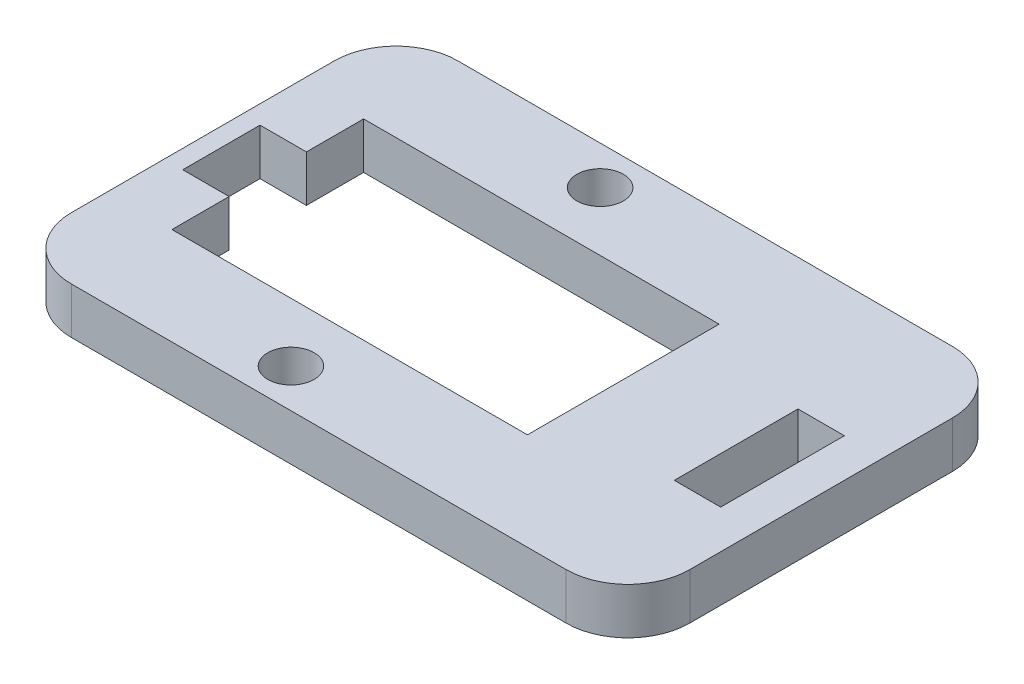
ISO-10303-21;
HEADER;
FILE_DESCRIPTION(('STEP AP214'),'2;1');
FILE_NAME('part.step','',(''),(''),'','','');
FILE_SCHEMA(('AUTOMOTIVE_DESIGN { 1 0 10303 214 1 1 1 1 }'));
ENDSEC;
DATA;
#1=APPLICATION_CONTEXT('core data for automotive mechanical design processes');
#2=APPLICATION_PROTOCOL_DEFINITION('international standard','automotive_design',2000,#1);
#3=PRODUCT_CONTEXT('',#1,'mechanical');
#4=PRODUCT('Part','Part','',(#3));
#5=PRODUCT_RELATED_PRODUCT_CATEGORY('part','',(#4));
#6=PRODUCT_DEFINITION_FORMATION('','',#4);
#7=PRODUCT_DEFINITION_CONTEXT('part definition',#1,'design');
#8=PRODUCT_DEFINITION('design','',#6,#7);
#9=PRODUCT_DEFINITION_SHAPE('','',#8);
#10=(LENGTH_UNIT() NAMED_UNIT(*) SI_UNIT(.MILLI.,.METRE.));
#11=(NAMED_UNIT(*) PLANE_ANGLE_UNIT() SI_UNIT($,.RADIAN.));
#12=(NAMED_UNIT(*) SI_UNIT($,.STERADIAN.) SOLID_ANGLE_UNIT());
#13=UNCERTAINTY_MEASURE_WITH_UNIT(LENGTH_MEASURE(1.E-05),#10,'distance_accuracy_value','');
#14=(GEOMETRIC_REPRESENTATION_CONTEXT(3) GLOBAL_UNCERTAINTY_ASSIGNED_CONTEXT((#13)) GLOBAL_UNIT_ASSIGNED_CONTEXT((#10,
#11,#12)) REPRESENTATION_CONTEXT('',''));
#15=CARTESIAN_POINT('',(0.,0.,0.));
#16=DIRECTION('',(0.,0.,1.));
#17=DIRECTION('',(1.,0.,0.));
#18=AXIS2_PLACEMENT_3D('',#15,#16,#17);
#19=CARTESIAN_POINT('',(4.2,3.,6.20000000000001));
#20=DIRECTION('',(-1.,0.,0.));
#21=DIRECTION('',(0.,0.,1.));
#22=AXIS2_PLACEMENT_3D('',#19,#20,#21);
#23=PLANE('',#22);
#24=DIRECTION('',(0.,0.,-1.));
#25=VECTOR('',#24,1.);
#26=CARTESIAN_POINT('',(4.2,0.,6.20000000000001));
#27=LINE('',#26,#25);
#28=CARTESIAN_POINT('',(4.2,0.,6.20000000000001));
#29=VERTEX_POINT('',#28);
#30=CARTESIAN_POINT('',(4.2,0.,2.5));
#31=VERTEX_POINT('',#30);
#32=EDGE_CURVE('E237',#29,#31,#27,.T.);
#33=ORIENTED_EDGE('',*,*,#32,.T.);
#34=DIRECTION('',(0.,-1.,0.));
#35=VECTOR('',#34,1.);
#36=CARTESIAN_POINT('',(4.2,3.,2.5));
#37=LINE('',#36,#35);
#38=CARTESIAN_POINT('',(4.2,3.,2.5));
#39=VERTEX_POINT('',#38);
#40=EDGE_CURVE('E209',#39,#31,#37,.T.);
#41=ORIENTED_EDGE('',*,*,#40,.F.);
#42=DIRECTION('',(0.,0.,-1.));
#43=VECTOR('',#42,1.);
#44=CARTESIAN_POINT('',(4.2,3.,6.20000000000001));
#45=LINE('',#44,#43);
#46=CARTESIAN_POINT('',(4.2,3.,6.20000000000001));
#47=VERTEX_POINT('',#46);
#48=EDGE_CURVE('E224',#47,#39,#45,.T.);
#49=ORIENTED_EDGE('',*,*,#48,.F.);
#50=DIRECTION('',(0.,-1.,0.));
#51=VECTOR('',#50,1.);
#52=CARTESIAN_POINT('',(4.2,3.,6.20000000000001));
#53=LINE('',#52,#51);
#54=EDGE_CURVE('E249',#47,#29,#53,.T.);
#55=ORIENTED_EDGE('',*,*,#54,.T.);
#56=EDGE_LOOP('',(#33,#41,#49,#55));
#57=FACE_BOUND('',#56,.T.);
#58=ADVANCED_FACE('F36',(#57),#23,.F.);
#59=CARTESIAN_POINT('',(0.,3.,0.));
#60=DIRECTION('',(0.,-1.,0.));
#61=DIRECTION('',(0.,0.,-1.));
#62=AXIS2_PLACEMENT_3D('',#59,#60,#61);
#63=PLANE('',#62);
#64=CARTESIAN_POINT('',(15.7,3.,-10.));
#65=DIRECTION('',(0.,-1.,0.));
#66=DIRECTION('',(0.,0.,-1.));
#67=AXIS2_PLACEMENT_3D('',#64,#65,#66);
#68=CIRCLE('',#67,1.5);
#69=CARTESIAN_POINT('',(15.7,3.,-11.5));
#70=VERTEX_POINT('',#69);
#71=EDGE_CURVE('E214',#70,#70,#68,.T.);
#72=ORIENTED_EDGE('',*,*,#71,.T.);
#73=EDGE_LOOP('',(#72));
#74=FACE_BOUND('',#73,.T.);
#75=CARTESIAN_POINT('',(15.7,3.,10.));
#76=DIRECTION('',(0.,-1.,0.));
#77=DIRECTION('',(0.,0.,-1.));
#78=AXIS2_PLACEMENT_3D('',#75,#76,#77);
#79=CIRCLE('',#78,1.5);
#80=CARTESIAN_POINT('',(15.7,3.,8.5));
#81=VERTEX_POINT('',#80);
#82=EDGE_CURVE('E220',#81,#81,#79,.T.);
#83=ORIENTED_EDGE('',*,*,#82,.T.);
#84=EDGE_LOOP('',(#83));
#85=FACE_BOUND('',#84,.T.);
#86=ORIENTED_EDGE('',*,*,#48,.T.);
#87=DIRECTION('',(-1.,0.,0.));
#88=VECTOR('',#87,1.);
#89=CARTESIAN_POINT('',(4.2,3.,2.5));
#90=LINE('',#89,#88);
#91=CARTESIAN_POINT('',(1.19999999999999,3.,2.5));
#92=VERTEX_POINT('',#91);
#93=EDGE_CURVE('E186',#39,#92,#90,.T.);
#94=ORIENTED_EDGE('',*,*,#93,.T.);
#95=DIRECTION('',(0.,0.,-1.));
#96=VECTOR('',#95,1.);
#97=CARTESIAN_POINT('',(1.19999999999999,3.,-2.5));
#98=LINE('',#97,#96);
#99=CARTESIAN_POINT('',(1.19999999999999,3.,-2.5));
#100=VERTEX_POINT('',#99);
#101=EDGE_CURVE('E179',#92,#100,#98,.T.);
#102=ORIENTED_EDGE('',*,*,#101,.T.);
#103=DIRECTION('',(1.,0.,0.));
#104=VECTOR('',#103,1.);
#105=CARTESIAN_POINT('',(4.2,3.,-2.5));
#106=LINE('',#105,#104);
#107=CARTESIAN_POINT('',(4.2,3.,-2.5));
#108=VERTEX_POINT('',#107);
#109=EDGE_CURVE('E189',#100,#108,#106,.T.);
#110=ORIENTED_EDGE('',*,*,#109,.T.);
#111=CARTESIAN_POINT('',(4.2,3.,-6.2));
#112=VERTEX_POINT('',#111);
#113=EDGE_CURVE('E227',#108,#112,#45,.T.);
#114=ORIENTED_EDGE('',*,*,#113,.T.);
#115=DIRECTION('',(1.,0.,0.));
#116=VECTOR('',#115,1.);
#117=CARTESIAN_POINT('',(27.2,3.,-6.19999999999998));
#118=LINE('',#117,#116);
#119=CARTESIAN_POINT('',(27.2,3.,-6.19999999999998));
#120=VERTEX_POINT('',#119);
#121=EDGE_CURVE('E226',#112,#120,#118,.T.);
#122=ORIENTED_EDGE('',*,*,#121,.T.);
#123=DIRECTION('',(0.,0.,1.));
#124=VECTOR('',#123,1.);
#125=CARTESIAN_POINT('',(27.2,3.,6.20000000000002));
#126=LINE('',#125,#124);
#127=CARTESIAN_POINT('',(27.2,3.,6.20000000000002));
#128=VERTEX_POINT('',#127);
#129=EDGE_CURVE('E230',#120,#128,#126,.T.);
#130=ORIENTED_EDGE('',*,*,#129,.T.);
#131=DIRECTION('',(-1.,0.,0.));
#132=VECTOR('',#131,1.);
#133=CARTESIAN_POINT('',(27.2,3.,6.20000000000002));
#134=LINE('',#133,#132);
#135=EDGE_CURVE('E233',#128,#47,#134,.T.);
#136=ORIENTED_EDGE('',*,*,#135,.T.);
#137=EDGE_LOOP('',(#86,#94,#102,#110,#114,#122,#130,#136));
#138=FACE_BOUND('',#137,.T.);
#139=DIRECTION('',(-1.,0.,0.));
#140=VECTOR('',#139,1.);
#141=CARTESIAN_POINT('',(40.,3.,-12.5));
#142=LINE('',#141,#140);
#143=CARTESIAN_POINT('',(36.,3.,-12.5));
#144=VERTEX_POINT('',#143);
#145=CARTESIAN_POINT('',(4.,3.,-12.5));
#146=VERTEX_POINT('',#145);
#147=EDGE_CURVE('E297',#144,#146,#142,.T.);
#148=ORIENTED_EDGE('',*,*,#147,.T.);
#149=CARTESIAN_POINT('',(4.,3.,-8.5));
#150=DIRECTION('',(0.,-1.,0.));
#151=DIRECTION('',(0.,0.,-1.));
#152=AXIS2_PLACEMENT_3D('',#149,#150,#151);
#153=CIRCLE('',#152,4.);
#154=CARTESIAN_POINT('',(0.,3.,-8.5));
#155=VERTEX_POINT('',#154);
#156=EDGE_CURVE('E332',#146,#155,#153,.F.);
#157=ORIENTED_EDGE('',*,*,#156,.T.);
#158=DIRECTION('',(0.,0.,1.));
#159=VECTOR('',#158,1.);
#160=CARTESIAN_POINT('',(0.,3.,-12.5));
#161=LINE('',#160,#159);
#162=CARTESIAN_POINT('',(0.,3.,8.5));
#163=VERTEX_POINT('',#162);
#164=EDGE_CURVE('E289',#155,#163,#161,.T.);
#165=ORIENTED_EDGE('',*,*,#164,.T.);
#166=CARTESIAN_POINT('',(4.,3.,8.5));
#167=DIRECTION('',(0.,-1.,0.));
#168=DIRECTION('',(0.,0.,-1.));
#169=AXIS2_PLACEMENT_3D('',#166,#167,#168);
#170=CIRCLE('',#169,4.);
#171=CARTESIAN_POINT('',(4.,3.,12.5));
#172=VERTEX_POINT('',#171);
#173=EDGE_CURVE('E328',#163,#172,#170,.F.);
#174=ORIENTED_EDGE('',*,*,#173,.T.);
#175=DIRECTION('',(1.,0.,0.));
#176=VECTOR('',#175,1.);
#177=CARTESIAN_POINT('',(40.,3.,12.5));
#178=LINE('',#177,#176);
#179=CARTESIAN_POINT('',(36.,3.,12.5));
#180=VERTEX_POINT('',#179);
#181=EDGE_CURVE('E292',#172,#180,#178,.T.);
#182=ORIENTED_EDGE('',*,*,#181,.T.);
#183=CARTESIAN_POINT('',(36.,3.,8.5));
#184=DIRECTION('',(0.,-1.,0.));
#185=DIRECTION('',(0.,0.,-1.));
#186=AXIS2_PLACEMENT_3D('',#183,#184,#185);
#187=CIRCLE('',#186,4.);
#188=CARTESIAN_POINT('',(40.,3.,8.5));
#189=VERTEX_POINT('',#188);
#190=EDGE_CURVE('E58',#180,#189,#187,.F.);
#191=ORIENTED_EDGE('',*,*,#190,.T.);
#192=DIRECTION('',(0.,0.,-1.));
#193=VECTOR('',#192,1.);
#194=CARTESIAN_POINT('',(40.,3.,-12.5));
#195=LINE('',#194,#193);
#196=CARTESIAN_POINT('',(40.,3.,-8.5));
#197=VERTEX_POINT('',#196);
#198=EDGE_CURVE('E295',#189,#197,#195,.T.);
#199=ORIENTED_EDGE('',*,*,#198,.T.);
#200=CARTESIAN_POINT('',(36.,3.,-8.5));
#201=DIRECTION('',(0.,-1.,0.));
#202=DIRECTION('',(0.,0.,-1.));
#203=AXIS2_PLACEMENT_3D('',#200,#201,#202);
#204=CIRCLE('',#203,4.);
#205=EDGE_CURVE('E330',#197,#144,#204,.F.);
#206=ORIENTED_EDGE('',*,*,#205,.T.);
#207=EDGE_LOOP('',(#148,#157,#165,#174,#182,#191,#199,#206));
#208=FACE_BOUND('',#207,.T.);
#209=DIRECTION('',(0.,0.,1.));
#210=VECTOR('',#209,1.);
#211=CARTESIAN_POINT('',(34.5,3.,-4.));
#212=LINE('',#211,#210);
#213=CARTESIAN_POINT('',(34.5,3.,-4.));
#214=VERTEX_POINT('',#213);
#215=CARTESIAN_POINT('',(34.5,3.,4.));
#216=VERTEX_POINT('',#215);
#217=EDGE_CURVE('E258',#214,#216,#212,.T.);
#218=ORIENTED_EDGE('',*,*,#217,.F.);
#219=DIRECTION('',(-1.,0.,0.));
#220=VECTOR('',#219,1.);
#221=CARTESIAN_POINT('',(37.5,3.,-4.));
#222=LINE('',#221,#220);
#223=CARTESIAN_POINT('',(37.5,3.,-4.));
#224=VERTEX_POINT('',#223);
#225=EDGE_CURVE('E266',#224,#214,#222,.T.);
#226=ORIENTED_EDGE('',*,*,#225,.F.);
#227=DIRECTION('',(0.,0.,-1.));
#228=VECTOR('',#227,1.);
#229=CARTESIAN_POINT('',(37.5,3.,-4.));
#230=LINE('',#229,#228);
#231=CARTESIAN_POINT('',(37.5,3.,4.));
#232=VERTEX_POINT('',#231);
#233=EDGE_CURVE('E263',#232,#224,#230,.T.);
#234=ORIENTED_EDGE('',*,*,#233,.F.);
#235=DIRECTION('',(1.,0.,0.));
#236=VECTOR('',#235,1.);
#237=CARTESIAN_POINT('',(37.5,3.,4.));
#238=LINE('',#237,#236);
#239=EDGE_CURVE('E260',#216,#232,#238,.T.);
#240=ORIENTED_EDGE('',*,*,#239,.F.);
#241=EDGE_LOOP('',(#218,#226,#234,#240));
#242=FACE_BOUND('',#241,.T.);
#243=ADVANCED_FACE('F196',(#74,#85,#138,#208,#242),#63,.F.);
#244=CARTESIAN_POINT('',(0.,0.,0.));
#245=DIRECTION('',(0.,-1.,0.));
#246=DIRECTION('',(0.,0.,-1.));
#247=AXIS2_PLACEMENT_3D('',#244,#245,#246);
#248=PLANE('',#247);
#249=DIRECTION('',(-1.,0.,0.));
#250=VECTOR('',#249,1.);
#251=CARTESIAN_POINT('',(4.2,0.,2.5));
#252=LINE('',#251,#250);
#253=CARTESIAN_POINT('',(1.19999999999999,0.,2.5));
#254=VERTEX_POINT('',#253);
#255=EDGE_CURVE('E197',#31,#254,#252,.T.);
#256=ORIENTED_EDGE('',*,*,#255,.F.);
#257=ORIENTED_EDGE('',*,*,#32,.F.);
#258=DIRECTION('',(-1.,0.,0.));
#259=VECTOR('',#258,1.);
#260=CARTESIAN_POINT('',(27.2,0.,6.20000000000002));
#261=LINE('',#260,#259);
#262=CARTESIAN_POINT('',(27.2,0.,6.20000000000002));
#263=VERTEX_POINT('',#262);
#264=EDGE_CURVE('E246',#263,#29,#261,.T.);
#265=ORIENTED_EDGE('',*,*,#264,.F.);
#266=DIRECTION('',(0.,0.,1.));
#267=VECTOR('',#266,1.);
#268=CARTESIAN_POINT('',(27.2,0.,6.20000000000002));
#269=LINE('',#268,#267);
#270=CARTESIAN_POINT('',(27.2,0.,-6.19999999999998));
#271=VERTEX_POINT('',#270);
#272=EDGE_CURVE('E243',#271,#263,#269,.T.);
#273=ORIENTED_EDGE('',*,*,#272,.F.);
#274=DIRECTION('',(1.,0.,0.));
#275=VECTOR('',#274,1.);
#276=CARTESIAN_POINT('',(27.2,0.,-6.19999999999998));
#277=LINE('',#276,#275);
#278=CARTESIAN_POINT('',(4.2,0.,-6.2));
#279=VERTEX_POINT('',#278);
#280=EDGE_CURVE('E240',#279,#271,#277,.T.);
#281=ORIENTED_EDGE('',*,*,#280,.F.);
#282=CARTESIAN_POINT('',(4.2,0.,-2.5));
#283=VERTEX_POINT('',#282);
#284=EDGE_CURVE('E223',#283,#279,#27,.T.);
#285=ORIENTED_EDGE('',*,*,#284,.F.);
#286=DIRECTION('',(1.,0.,0.));
#287=VECTOR('',#286,1.);
#288=CARTESIAN_POINT('',(4.2,0.,-2.5));
#289=LINE('',#288,#287);
#290=CARTESIAN_POINT('',(1.19999999999999,0.,-2.5));
#291=VERTEX_POINT('',#290);
#292=EDGE_CURVE('E200',#291,#283,#289,.T.);
#293=ORIENTED_EDGE('',*,*,#292,.F.);
#294=DIRECTION('',(0.,0.,-1.));
#295=VECTOR('',#294,1.);
#296=CARTESIAN_POINT('',(1.19999999999999,0.,-2.5));
#297=LINE('',#296,#295);
#298=EDGE_CURVE('E182',#254,#291,#297,.T.);
#299=ORIENTED_EDGE('',*,*,#298,.F.);
#300=EDGE_LOOP('',(#256,#257,#265,#273,#281,#285,#293,#299));
#301=FACE_BOUND('',#300,.T.);
#302=CARTESIAN_POINT('',(15.7,0.,-10.));
#303=DIRECTION('',(0.,-1.,0.));
#304=DIRECTION('',(0.,0.,-1.));
#305=AXIS2_PLACEMENT_3D('',#302,#303,#304);
#306=CIRCLE('',#305,1.5);
#307=CARTESIAN_POINT('',(15.7,0.,-11.5));
#308=VERTEX_POINT('',#307);
#309=EDGE_CURVE('E208',#308,#308,#306,.T.);
#310=ORIENTED_EDGE('',*,*,#309,.F.);
#311=EDGE_LOOP('',(#310));
#312=FACE_BOUND('',#311,.T.);
#313=CARTESIAN_POINT('',(15.7,0.,10.));
#314=DIRECTION('',(0.,-1.,0.));
#315=DIRECTION('',(0.,0.,-1.));
#316=AXIS2_PLACEMENT_3D('',#313,#314,#315);
#317=CIRCLE('',#316,1.5);
#318=CARTESIAN_POINT('',(15.7,0.,8.5));
#319=VERTEX_POINT('',#318);
#320=EDGE_CURVE('E217',#319,#319,#317,.T.);
#321=ORIENTED_EDGE('',*,*,#320,.F.);
#322=EDGE_LOOP('',(#321));
#323=FACE_BOUND('',#322,.T.);
#324=DIRECTION('',(0.,0.,1.));
#325=VECTOR('',#324,1.);
#326=CARTESIAN_POINT('',(0.,0.,-12.5));
#327=LINE('',#326,#325);
#328=CARTESIAN_POINT('',(0.,0.,-8.5));
#329=VERTEX_POINT('',#328);
#330=CARTESIAN_POINT('',(0.,0.,8.5));
#331=VERTEX_POINT('',#330);
#332=EDGE_CURVE('E288',#329,#331,#327,.T.);
#333=ORIENTED_EDGE('',*,*,#332,.F.);
#334=CARTESIAN_POINT('',(4.,0.,-8.5));
#335=DIRECTION('',(0.,-1.,0.));
#336=DIRECTION('',(0.,0.,-1.));
#337=AXIS2_PLACEMENT_3D('',#334,#335,#336);
#338=CIRCLE('',#337,4.);
#339=CARTESIAN_POINT('',(4.,0.,-12.5));
#340=VERTEX_POINT('',#339);
#341=EDGE_CURVE('E320',#329,#340,#338,.T.);
#342=ORIENTED_EDGE('',*,*,#341,.T.);
#343=DIRECTION('',(-1.,0.,0.));
#344=VECTOR('',#343,1.);
#345=CARTESIAN_POINT('',(40.,0.,-12.5));
#346=LINE('',#345,#344);
#347=CARTESIAN_POINT('',(36.,0.,-12.5));
#348=VERTEX_POINT('',#347);
#349=EDGE_CURVE('E293',#348,#340,#346,.T.);
#350=ORIENTED_EDGE('',*,*,#349,.F.);
#351=CARTESIAN_POINT('',(36.,0.,-8.5));
#352=DIRECTION('',(0.,-1.,0.));
#353=DIRECTION('',(0.,0.,-1.));
#354=AXIS2_PLACEMENT_3D('',#351,#352,#353);
#355=CIRCLE('',#354,4.);
#356=CARTESIAN_POINT('',(40.,0.,-8.5));
#357=VERTEX_POINT('',#356);
#358=EDGE_CURVE('E318',#348,#357,#355,.T.);
#359=ORIENTED_EDGE('',*,*,#358,.T.);
#360=DIRECTION('',(0.,0.,-1.));
#361=VECTOR('',#360,1.);
#362=CARTESIAN_POINT('',(40.,0.,-12.5));
#363=LINE('',#362,#361);
#364=CARTESIAN_POINT('',(40.,0.,8.5));
#365=VERTEX_POINT('',#364);
#366=EDGE_CURVE('E306',#365,#357,#363,.T.);
#367=ORIENTED_EDGE('',*,*,#366,.F.);
#368=CARTESIAN_POINT('',(36.,0.,8.5));
#369=DIRECTION('',(0.,-1.,0.));
#370=DIRECTION('',(0.,0.,-1.));
#371=AXIS2_PLACEMENT_3D('',#368,#369,#370);
#372=CIRCLE('',#371,4.);
#373=CARTESIAN_POINT('',(36.,0.,12.5));
#374=VERTEX_POINT('',#373);
#375=EDGE_CURVE('E314',#365,#374,#372,.T.);
#376=ORIENTED_EDGE('',*,*,#375,.T.);
#377=DIRECTION('',(1.,0.,0.));
#378=VECTOR('',#377,1.);
#379=CARTESIAN_POINT('',(40.,0.,12.5));
#380=LINE('',#379,#378);
#381=CARTESIAN_POINT('',(4.,0.,12.5));
#382=VERTEX_POINT('',#381);
#383=EDGE_CURVE('E303',#382,#374,#380,.T.);
#384=ORIENTED_EDGE('',*,*,#383,.F.);
#385=CARTESIAN_POINT('',(4.,0.,8.5));
#386=DIRECTION('',(0.,-1.,0.));
#387=DIRECTION('',(0.,0.,-1.));
#388=AXIS2_PLACEMENT_3D('',#385,#386,#387);
#389=CIRCLE('',#388,4.);
#390=EDGE_CURVE('E316',#382,#331,#389,.T.);
#391=ORIENTED_EDGE('',*,*,#390,.T.);
#392=EDGE_LOOP('',(#333,#342,#350,#359,#367,#376,#384,#391));
#393=FACE_BOUND('',#392,.T.);
#394=DIRECTION('',(-1.,0.,0.));
#395=VECTOR('',#394,1.);
#396=CARTESIAN_POINT('',(37.5,0.,-4.));
#397=LINE('',#396,#395);
#398=CARTESIAN_POINT('',(37.5,0.,-4.));
#399=VERTEX_POINT('',#398);
#400=CARTESIAN_POINT('',(34.5,0.,-4.));
#401=VERTEX_POINT('',#400);
#402=EDGE_CURVE('E261',#399,#401,#397,.T.);
#403=ORIENTED_EDGE('',*,*,#402,.T.);
#404=DIRECTION('',(0.,0.,1.));
#405=VECTOR('',#404,1.);
#406=CARTESIAN_POINT('',(34.5,0.,-4.));
#407=LINE('',#406,#405);
#408=CARTESIAN_POINT('',(34.5,0.,4.));
#409=VERTEX_POINT('',#408);
#410=EDGE_CURVE('E251',#401,#409,#407,.T.);
#411=ORIENTED_EDGE('',*,*,#410,.T.);
#412=DIRECTION('',(1.,0.,0.));
#413=VECTOR('',#412,1.);
#414=CARTESIAN_POINT('',(37.5,0.,4.));
#415=LINE('',#414,#413);
#416=CARTESIAN_POINT('',(37.5,0.,4.));
#417=VERTEX_POINT('',#416);
#418=EDGE_CURVE('E271',#409,#417,#415,.T.);
#419=ORIENTED_EDGE('',*,*,#418,.T.);
#420=DIRECTION('',(0.,0.,-1.));
#421=VECTOR('',#420,1.);
#422=CARTESIAN_POINT('',(37.5,0.,-4.));
#423=LINE('',#422,#421);
#424=EDGE_CURVE('E274',#417,#399,#423,.T.);
#425=ORIENTED_EDGE('',*,*,#424,.T.);
#426=EDGE_LOOP('',(#403,#411,#419,#425));
#427=FACE_BOUND('',#426,.T.);
#428=ADVANCED_FACE('F351',(#301,#312,#323,#393,#427),#248,.T.);
#429=CARTESIAN_POINT('',(0.,3.,-12.5));
#430=DIRECTION('',(1.,0.,0.));
#431=DIRECTION('',(0.,0.,-1.));
#432=AXIS2_PLACEMENT_3D('',#429,#430,#431);
#433=PLANE('',#432);
#434=ORIENTED_EDGE('',*,*,#164,.F.);
#435=DIRECTION('',(0.,-1.,0.));
#436=VECTOR('',#435,1.);
#437=CARTESIAN_POINT('',(0.,3.,-8.5));
#438=LINE('',#437,#436);
#439=EDGE_CURVE('E311',#155,#329,#438,.T.);
#440=ORIENTED_EDGE('',*,*,#439,.T.);
#441=ORIENTED_EDGE('',*,*,#332,.T.);
#442=DIRECTION('',(0.,-1.,0.));
#443=VECTOR('',#442,1.);
#444=CARTESIAN_POINT('',(0.,3.,8.5));
#445=LINE('',#444,#443);
#446=EDGE_CURVE('E300',#331,#163,#445,.F.);
#447=ORIENTED_EDGE('',*,*,#446,.T.);
#448=EDGE_LOOP('',(#434,#440,#441,#447));
#449=FACE_BOUND('',#448,.T.);
#450=ADVANCED_FACE('F368',(#449),#433,.F.);
#451=CARTESIAN_POINT('',(40.,3.,12.5));
#452=DIRECTION('',(0.,0.,-1.));
#453=DIRECTION('',(-1.,0.,0.));
#454=AXIS2_PLACEMENT_3D('',#451,#452,#453);
#455=PLANE('',#454);
#456=ORIENTED_EDGE('',*,*,#181,.F.);
#457=DIRECTION('',(0.,-1.,0.));
#458=VECTOR('',#457,1.);
#459=CARTESIAN_POINT('',(4.,3.,12.5));
#460=LINE('',#459,#458);
#461=EDGE_CURVE('E11',#172,#382,#460,.T.);
#462=ORIENTED_EDGE('',*,*,#461,.T.);
#463=ORIENTED_EDGE('',*,*,#383,.T.);
#464=DIRECTION('',(0.,-1.,0.));
#465=VECTOR('',#464,1.);
#466=CARTESIAN_POINT('',(36.,3.,12.5));
#467=LINE('',#466,#465);
#468=EDGE_CURVE('E44',#374,#180,#467,.F.);
#469=ORIENTED_EDGE('',*,*,#468,.T.);
#470=EDGE_LOOP('',(#456,#462,#463,#469));
#471=FACE_BOUND('',#470,.T.);
#472=ADVANCED_FACE('F340',(#471),#455,.F.);
#473=CARTESIAN_POINT('',(40.,3.,-12.5));
#474=DIRECTION('',(-1.,0.,0.));
#475=DIRECTION('',(0.,0.,1.));
#476=AXIS2_PLACEMENT_3D('',#473,#474,#475);
#477=PLANE('',#476);
#478=ORIENTED_EDGE('',*,*,#366,.T.);
#479=DIRECTION('',(0.,-1.,0.));
#480=VECTOR('',#479,1.);
#481=CARTESIAN_POINT('',(40.,3.,-8.5));
#482=LINE('',#481,#480);
#483=EDGE_CURVE('E51',#357,#197,#482,.F.);
#484=ORIENTED_EDGE('',*,*,#483,.T.);
#485=ORIENTED_EDGE('',*,*,#198,.F.);
#486=DIRECTION('',(0.,-1.,0.));
#487=VECTOR('',#486,1.);
#488=CARTESIAN_POINT('',(40.,3.,8.5));
#489=LINE('',#488,#487);
#490=EDGE_CURVE('E334',#189,#365,#489,.T.);
#491=ORIENTED_EDGE('',*,*,#490,.T.);
#492=EDGE_LOOP('',(#478,#484,#485,#491));
#493=FACE_BOUND('',#492,.T.);
#494=ADVANCED_FACE('F348',(#493),#477,.F.);
#495=CARTESIAN_POINT('',(40.,3.,-12.5));
#496=DIRECTION('',(0.,0.,1.));
#497=DIRECTION('',(1.,0.,0.));
#498=AXIS2_PLACEMENT_3D('',#495,#496,#497);
#499=PLANE('',#498);
#500=ORIENTED_EDGE('',*,*,#349,.T.);
#501=DIRECTION('',(0.,-1.,0.));
#502=VECTOR('',#501,1.);
#503=CARTESIAN_POINT('',(4.,3.,-12.5));
#504=LINE('',#503,#502);
#505=EDGE_CURVE('E325',#340,#146,#504,.F.);
#506=ORIENTED_EDGE('',*,*,#505,.T.);
#507=ORIENTED_EDGE('',*,*,#147,.F.);
#508=DIRECTION('',(0.,-1.,0.));
#509=VECTOR('',#508,1.);
#510=CARTESIAN_POINT('',(36.,3.,-12.5));
#511=LINE('',#510,#509);
#512=EDGE_CURVE('E322',#144,#348,#511,.T.);
#513=ORIENTED_EDGE('',*,*,#512,.T.);
#514=EDGE_LOOP('',(#500,#506,#507,#513));
#515=FACE_BOUND('',#514,.T.);
#516=ADVANCED_FACE('F360',(#515),#499,.F.);
#517=CARTESIAN_POINT('',(34.5,3.,-4.));
#518=DIRECTION('',(1.,0.,0.));
#519=DIRECTION('',(0.,0.,-1.));
#520=AXIS2_PLACEMENT_3D('',#517,#518,#519);
#521=PLANE('',#520);
#522=ORIENTED_EDGE('',*,*,#410,.F.);
#523=DIRECTION('',(0.,-1.,0.));
#524=VECTOR('',#523,1.);
#525=CARTESIAN_POINT('',(34.5,3.,-4.));
#526=LINE('',#525,#524);
#527=EDGE_CURVE('E268',#214,#401,#526,.T.);
#528=ORIENTED_EDGE('',*,*,#527,.F.);
#529=ORIENTED_EDGE('',*,*,#217,.T.);
#530=DIRECTION('',(0.,-1.,0.));
#531=VECTOR('',#530,1.);
#532=CARTESIAN_POINT('',(34.5,3.,4.));
#533=LINE('',#532,#531);
#534=EDGE_CURVE('E285',#216,#409,#533,.T.);
#535=ORIENTED_EDGE('',*,*,#534,.T.);
#536=EDGE_LOOP('',(#522,#528,#529,#535));
#537=FACE_BOUND('',#536,.T.);
#538=ADVANCED_FACE('F535',(#537),#521,.T.);
#539=CARTESIAN_POINT('',(37.5,3.,4.));
#540=DIRECTION('',(0.,0.,-1.));
#541=DIRECTION('',(-1.,0.,0.));
#542=AXIS2_PLACEMENT_3D('',#539,#540,#541);
#543=PLANE('',#542);
#544=ORIENTED_EDGE('',*,*,#418,.F.);
#545=ORIENTED_EDGE('',*,*,#534,.F.);
#546=ORIENTED_EDGE('',*,*,#239,.T.);
#547=DIRECTION('',(0.,-1.,0.));
#548=VECTOR('',#547,1.);
#549=CARTESIAN_POINT('',(37.5,3.,4.));
#550=LINE('',#549,#548);
#551=EDGE_CURVE('E283',#232,#417,#550,.T.);
#552=ORIENTED_EDGE('',*,*,#551,.T.);
#553=EDGE_LOOP('',(#544,#545,#546,#552));
#554=FACE_BOUND('',#553,.T.);
#555=ADVANCED_FACE('F580',(#554),#543,.T.);
#556=CARTESIAN_POINT('',(37.5,3.,-4.));
#557=DIRECTION('',(-1.,0.,0.));
#558=DIRECTION('',(0.,0.,1.));
#559=AXIS2_PLACEMENT_3D('',#556,#557,#558);
#560=PLANE('',#559);
#561=ORIENTED_EDGE('',*,*,#424,.F.);
#562=ORIENTED_EDGE('',*,*,#551,.F.);
#563=ORIENTED_EDGE('',*,*,#233,.T.);
#564=DIRECTION('',(0.,-1.,0.));
#565=VECTOR('',#564,1.);
#566=CARTESIAN_POINT('',(37.5,3.,-4.));
#567=LINE('',#566,#565);
#568=EDGE_CURVE('E281',#224,#399,#567,.T.);
#569=ORIENTED_EDGE('',*,*,#568,.T.);
#570=EDGE_LOOP('',(#561,#562,#563,#569));
#571=FACE_BOUND('',#570,.T.);
#572=ADVANCED_FACE('F400',(#571),#560,.T.);
#573=CARTESIAN_POINT('',(37.5,3.,-4.));
#574=DIRECTION('',(0.,0.,1.));
#575=DIRECTION('',(1.,0.,0.));
#576=AXIS2_PLACEMENT_3D('',#573,#574,#575);
#577=PLANE('',#576);
#578=ORIENTED_EDGE('',*,*,#402,.F.);
#579=ORIENTED_EDGE('',*,*,#568,.F.);
#580=ORIENTED_EDGE('',*,*,#225,.T.);
#581=ORIENTED_EDGE('',*,*,#527,.T.);
#582=EDGE_LOOP('',(#578,#579,#580,#581));
#583=FACE_BOUND('',#582,.T.);
#584=ADVANCED_FACE('F391',(#583),#577,.T.);
#585=ORIENTED_EDGE('',*,*,#113,.F.);
#586=DIRECTION('',(0.,-1.,0.));
#587=VECTOR('',#586,1.);
#588=CARTESIAN_POINT('',(4.2,3.,-2.5));
#589=LINE('',#588,#587);
#590=EDGE_CURVE('E185',#108,#283,#589,.T.);
#591=ORIENTED_EDGE('',*,*,#590,.T.);
#592=ORIENTED_EDGE('',*,*,#284,.T.);
#593=DIRECTION('',(0.,-1.,0.));
#594=VECTOR('',#593,1.);
#595=CARTESIAN_POINT('',(4.2,3.,-6.2));
#596=LINE('',#595,#594);
#597=EDGE_CURVE('E236',#112,#279,#596,.T.);
#598=ORIENTED_EDGE('',*,*,#597,.F.);
#599=EDGE_LOOP('',(#585,#591,#592,#598));
#600=FACE_BOUND('',#599,.T.);
#601=ADVANCED_FACE('F381',(#600),#23,.F.);
#602=CARTESIAN_POINT('',(27.2,3.,6.20000000000002));
#603=DIRECTION('',(0.,0.,1.));
#604=DIRECTION('',(1.,0.,0.));
#605=AXIS2_PLACEMENT_3D('',#602,#603,#604);
#606=PLANE('',#605);
#607=ORIENTED_EDGE('',*,*,#264,.T.);
#608=ORIENTED_EDGE('',*,*,#54,.F.);
#609=ORIENTED_EDGE('',*,*,#135,.F.);
#610=DIRECTION('',(0.,-1.,0.));
#611=VECTOR('',#610,1.);
#612=CARTESIAN_POINT('',(27.2,3.,6.20000000000002));
#613=LINE('',#612,#611);
#614=EDGE_CURVE('E252',#128,#263,#613,.T.);
#615=ORIENTED_EDGE('',*,*,#614,.T.);
#616=EDGE_LOOP('',(#607,#608,#609,#615));
#617=FACE_BOUND('',#616,.T.);
#618=ADVANCED_FACE('F390',(#617),#606,.F.);
#619=CARTESIAN_POINT('',(27.2,3.,6.20000000000002));
#620=DIRECTION('',(1.,0.,0.));
#621=DIRECTION('',(0.,0.,-1.));
#622=AXIS2_PLACEMENT_3D('',#619,#620,#621);
#623=PLANE('',#622);
#624=ORIENTED_EDGE('',*,*,#272,.T.);
#625=ORIENTED_EDGE('',*,*,#614,.F.);
#626=ORIENTED_EDGE('',*,*,#129,.F.);
#627=DIRECTION('',(0.,-1.,0.));
#628=VECTOR('',#627,1.);
#629=CARTESIAN_POINT('',(27.2,3.,-6.19999999999998));
#630=LINE('',#629,#628);
#631=EDGE_CURVE('E254',#120,#271,#630,.T.);
#632=ORIENTED_EDGE('',*,*,#631,.T.);
#633=EDGE_LOOP('',(#624,#625,#626,#632));
#634=FACE_BOUND('',#633,.T.);
#635=ADVANCED_FACE('F397',(#634),#623,.F.);
#636=CARTESIAN_POINT('',(27.2,3.,-6.19999999999998));
#637=DIRECTION('',(0.,0.,-1.));
#638=DIRECTION('',(-1.,0.,0.));
#639=AXIS2_PLACEMENT_3D('',#636,#637,#638);
#640=PLANE('',#639);
#641=ORIENTED_EDGE('',*,*,#280,.T.);
#642=ORIENTED_EDGE('',*,*,#631,.F.);
#643=ORIENTED_EDGE('',*,*,#121,.F.);
#644=ORIENTED_EDGE('',*,*,#597,.T.);
#645=EDGE_LOOP('',(#641,#642,#643,#644));
#646=FACE_BOUND('',#645,.T.);
#647=ADVANCED_FACE('F407',(#646),#640,.F.);
#648=CARTESIAN_POINT('',(15.7,0.,10.));
#649=DIRECTION('',(0.,-1.,0.));
#650=DIRECTION('',(0.,0.,-1.));
#651=AXIS2_PLACEMENT_3D('',#648,#649,#650);
#652=CYLINDRICAL_SURFACE('',#651,1.5);
#653=ORIENTED_EDGE('',*,*,#82,.F.);
#654=EDGE_LOOP('',(#653));
#655=FACE_BOUND('',#654,.T.);
#656=ORIENTED_EDGE('',*,*,#320,.T.);
#657=EDGE_LOOP('',(#656));
#658=FACE_BOUND('',#657,.T.);
#659=ADVANCED_FACE('F427',(#655,#658),#652,.F.);
#660=CARTESIAN_POINT('',(15.7,0.,-10.));
#661=DIRECTION('',(0.,-1.,0.));
#662=DIRECTION('',(0.,0.,-1.));
#663=AXIS2_PLACEMENT_3D('',#660,#661,#662);
#664=CYLINDRICAL_SURFACE('',#663,1.5);
#665=ORIENTED_EDGE('',*,*,#71,.F.);
#666=EDGE_LOOP('',(#665));
#667=FACE_BOUND('',#666,.T.);
#668=ORIENTED_EDGE('',*,*,#309,.T.);
#669=EDGE_LOOP('',(#668));
#670=FACE_BOUND('',#669,.T.);
#671=ADVANCED_FACE('F429',(#667,#670),#664,.F.);
#672=CARTESIAN_POINT('',(1.19999999999999,3.,-2.5));
#673=DIRECTION('',(-1.,0.,0.));
#674=DIRECTION('',(0.,0.,1.));
#675=AXIS2_PLACEMENT_3D('',#672,#673,#674);
#676=PLANE('',#675);
#677=ORIENTED_EDGE('',*,*,#298,.T.);
#678=DIRECTION('',(0.,-1.,0.));
#679=VECTOR('',#678,1.);
#680=CARTESIAN_POINT('',(1.19999999999999,3.,-2.5));
#681=LINE('',#680,#679);
#682=EDGE_CURVE('E175',#100,#291,#681,.T.);
#683=ORIENTED_EDGE('',*,*,#682,.F.);
#684=ORIENTED_EDGE('',*,*,#101,.F.);
#685=DIRECTION('',(0.,-1.,0.));
#686=VECTOR('',#685,1.);
#687=CARTESIAN_POINT('',(1.19999999999999,3.,2.5));
#688=LINE('',#687,#686);
#689=EDGE_CURVE('E206',#92,#254,#688,.T.);
#690=ORIENTED_EDGE('',*,*,#689,.T.);
#691=EDGE_LOOP('',(#677,#683,#684,#690));
#692=FACE_BOUND('',#691,.T.);
#693=ADVANCED_FACE('F177',(#692),#676,.F.);
#694=CARTESIAN_POINT('',(4.2,3.,2.5));
#695=DIRECTION('',(0.,0.,1.));
#696=DIRECTION('',(1.,0.,0.));
#697=AXIS2_PLACEMENT_3D('',#694,#695,#696);
#698=PLANE('',#697);
#699=ORIENTED_EDGE('',*,*,#255,.T.);
#700=ORIENTED_EDGE('',*,*,#689,.F.);
#701=ORIENTED_EDGE('',*,*,#93,.F.);
#702=ORIENTED_EDGE('',*,*,#40,.T.);
#703=EDGE_LOOP('',(#699,#700,#701,#702));
#704=FACE_BOUND('',#703,.T.);
#705=ADVANCED_FACE('F418',(#704),#698,.F.);
#706=CARTESIAN_POINT('',(4.2,3.,-2.5));
#707=DIRECTION('',(0.,0.,-1.));
#708=DIRECTION('',(-1.,0.,0.));
#709=AXIS2_PLACEMENT_3D('',#706,#707,#708);
#710=PLANE('',#709);
#711=ORIENTED_EDGE('',*,*,#292,.T.);
#712=ORIENTED_EDGE('',*,*,#590,.F.);
#713=ORIENTED_EDGE('',*,*,#109,.F.);
#714=ORIENTED_EDGE('',*,*,#682,.T.);
#715=EDGE_LOOP('',(#711,#712,#713,#714));
#716=FACE_BOUND('',#715,.T.);
#717=ADVANCED_FACE('F190',(#716),#710,.F.);
#718=CARTESIAN_POINT('',(4.,3.,-8.5));
#719=DIRECTION('',(0.,-1.,0.));
#720=DIRECTION('',(0.,0.,-1.));
#721=AXIS2_PLACEMENT_3D('',#718,#719,#720);
#722=CYLINDRICAL_SURFACE('',#721,4.);
#723=ORIENTED_EDGE('',*,*,#156,.F.);
#724=ORIENTED_EDGE('',*,*,#505,.F.);
#725=ORIENTED_EDGE('',*,*,#341,.F.);
#726=ORIENTED_EDGE('',*,*,#439,.F.);
#727=EDGE_LOOP('',(#723,#724,#725,#726));
#728=FACE_BOUND('',#727,.T.);
#729=ADVANCED_FACE('F366',(#728),#722,.T.);
#730=CARTESIAN_POINT('',(36.,3.,-8.5));
#731=DIRECTION('',(0.,-1.,0.));
#732=DIRECTION('',(0.,0.,-1.));
#733=AXIS2_PLACEMENT_3D('',#730,#731,#732);
#734=CYLINDRICAL_SURFACE('',#733,4.);
#735=ORIENTED_EDGE('',*,*,#205,.F.);
#736=ORIENTED_EDGE('',*,*,#483,.F.);
#737=ORIENTED_EDGE('',*,*,#358,.F.);
#738=ORIENTED_EDGE('',*,*,#512,.F.);
#739=EDGE_LOOP('',(#735,#736,#737,#738));
#740=FACE_BOUND('',#739,.T.);
#741=ADVANCED_FACE('F357',(#740),#734,.T.);
#742=CARTESIAN_POINT('',(4.,3.,8.5));
#743=DIRECTION('',(0.,-1.,0.));
#744=DIRECTION('',(0.,0.,-1.));
#745=AXIS2_PLACEMENT_3D('',#742,#743,#744);
#746=CYLINDRICAL_SURFACE('',#745,4.);
#747=ORIENTED_EDGE('',*,*,#173,.F.);
#748=ORIENTED_EDGE('',*,*,#446,.F.);
#749=ORIENTED_EDGE('',*,*,#390,.F.);
#750=ORIENTED_EDGE('',*,*,#461,.F.);
#751=EDGE_LOOP('',(#747,#748,#749,#750));
#752=FACE_BOUND('',#751,.T.);
#753=ADVANCED_FACE('F371',(#752),#746,.T.);
#754=CARTESIAN_POINT('',(36.,3.,8.5));
#755=DIRECTION('',(0.,-1.,0.));
#756=DIRECTION('',(0.,0.,-1.));
#757=AXIS2_PLACEMENT_3D('',#754,#755,#756);
#758=CYLINDRICAL_SURFACE('',#757,4.);
#759=ORIENTED_EDGE('',*,*,#190,.F.);
#760=ORIENTED_EDGE('',*,*,#468,.F.);
#761=ORIENTED_EDGE('',*,*,#375,.F.);
#762=ORIENTED_EDGE('',*,*,#490,.F.);
#763=EDGE_LOOP('',(#759,#760,#761,#762));
#764=FACE_BOUND('',#763,.T.);
#765=ADVANCED_FACE('F38',(#764),#758,.T.);
#766=CLOSED_SHELL('',(#58,#243,#428,#450,#472,#494,#516,#538,#555,#572,#584,#601,#618,#635,#647,
#659,#671,#693,#705,#717,#729,#741,#753,#765));
#767=MANIFOLD_SOLID_BREP('B2',#766);
#768=ADVANCED_BREP_SHAPE_REPRESENTATION('',(#18,#767),#14);
#769=SHAPE_DEFINITION_REPRESENTATION(#9,#768);
ENDSEC;
END-ISO-10303-21;
